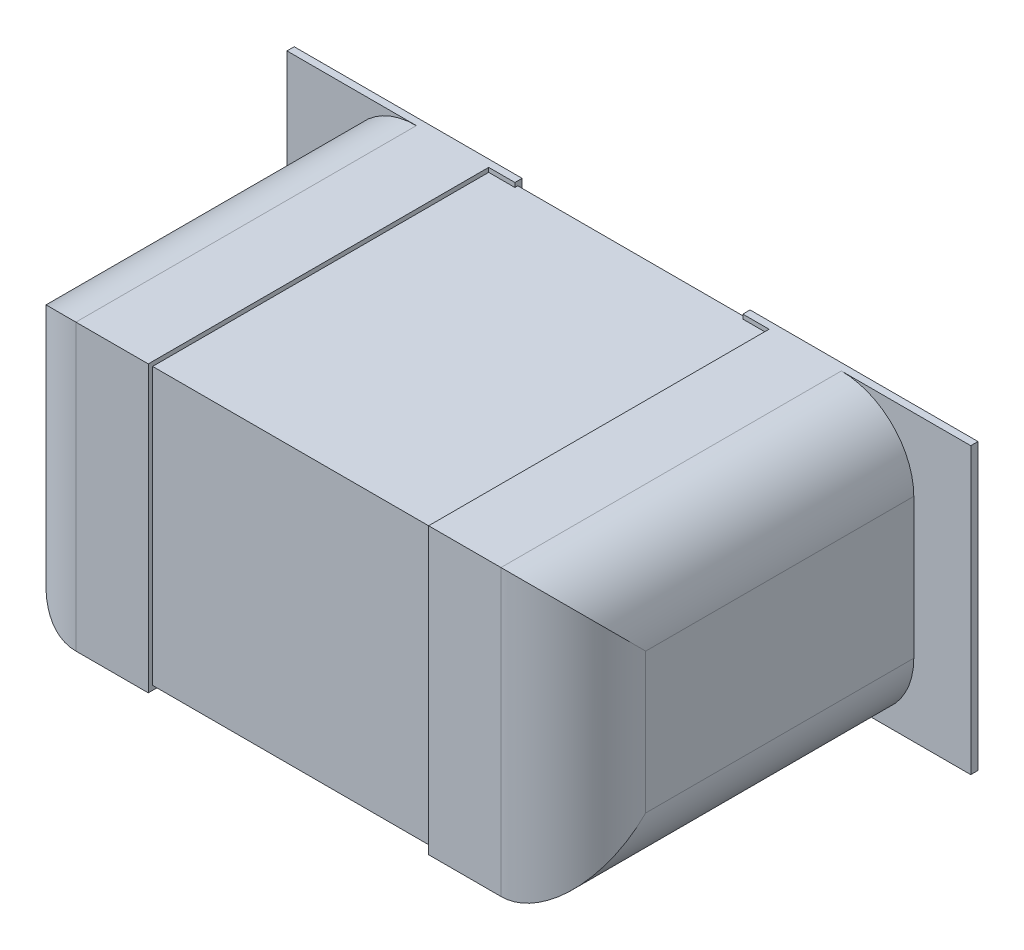
ISO-10303-21;
HEADER;
FILE_DESCRIPTION(('STEP AP214'),'2;1');
FILE_NAME('part.step','',(''),(''),'','','');
FILE_SCHEMA(('AUTOMOTIVE_DESIGN { 1 0 10303 214 1 1 1 1 }'));
ENDSEC;
DATA;
#1=APPLICATION_CONTEXT('core data for automotive mechanical design processes');
#2=APPLICATION_PROTOCOL_DEFINITION('international standard','automotive_design',2000,#1);
#3=PRODUCT_CONTEXT('',#1,'mechanical');
#4=PRODUCT('Part','Part','',(#3));
#5=PRODUCT_RELATED_PRODUCT_CATEGORY('part','',(#4));
#6=PRODUCT_DEFINITION_FORMATION('','',#4);
#7=PRODUCT_DEFINITION_CONTEXT('part definition',#1,'design');
#8=PRODUCT_DEFINITION('design','',#6,#7);
#9=PRODUCT_DEFINITION_SHAPE('','',#8);
#10=(LENGTH_UNIT() NAMED_UNIT(*) SI_UNIT(.MILLI.,.METRE.));
#11=(NAMED_UNIT(*) PLANE_ANGLE_UNIT() SI_UNIT($,.RADIAN.));
#12=(NAMED_UNIT(*) SI_UNIT($,.STERADIAN.) SOLID_ANGLE_UNIT());
#13=UNCERTAINTY_MEASURE_WITH_UNIT(LENGTH_MEASURE(1.E-05),#10,'distance_accuracy_value','');
#14=(GEOMETRIC_REPRESENTATION_CONTEXT(3) GLOBAL_UNCERTAINTY_ASSIGNED_CONTEXT((#13)) GLOBAL_UNIT_ASSIGNED_CONTEXT((#10,
#11,#12)) REPRESENTATION_CONTEXT('',''));
#15=CARTESIAN_POINT('',(0.,0.,0.));
#16=DIRECTION('',(0.,0.,1.));
#17=DIRECTION('',(1.,0.,0.));
#18=AXIS2_PLACEMENT_3D('',#15,#16,#17);
#19=CARTESIAN_POINT('',(0.500000000000032,-0.249999999999991,0.0762));
#20=DIRECTION('',(1.,0.,0.));
#21=DIRECTION('',(0.,0.,-1.));
#22=AXIS2_PLACEMENT_3D('',#19,#20,#21);
#23=PLANE('',#22);
#24=DIRECTION('',(0.,0.,-1.));
#25=VECTOR('',#24,1.);
#26=CARTESIAN_POINT('',(0.500000000000032,-0.122999999999991,0.68855504704387));
#27=LINE('',#26,#25);
#28=CARTESIAN_POINT('',(0.500000000000032,-0.122999999999991,0.0889));
#29=VERTEX_POINT('',#28);
#30=CARTESIAN_POINT('',(0.500000000000032,-0.122999999999991,0.559308));
#31=VERTEX_POINT('',#30);
#32=EDGE_CURVE('E325',#29,#31,#27,.F.);
#33=ORIENTED_EDGE('',*,*,#32,.F.);
#34=DIRECTION('',(0.,1.,0.));
#35=VECTOR('',#34,1.);
#36=CARTESIAN_POINT('',(0.500000000000032,0.,0.0889));
#37=LINE('',#36,#35);
#38=CARTESIAN_POINT('',(0.500000000000032,0.122999999999991,0.0889));
#39=VERTEX_POINT('',#38);
#40=EDGE_CURVE('E238',#39,#29,#37,.F.);
#41=ORIENTED_EDGE('',*,*,#40,.F.);
#42=DIRECTION('',(0.,0.,-1.));
#43=VECTOR('',#42,1.);
#44=CARTESIAN_POINT('',(0.500000000000032,0.122999999999991,0.68855504704387));
#45=LINE('',#44,#43);
#46=CARTESIAN_POINT('',(0.500000000000032,0.122999999999991,0.559308));
#47=VERTEX_POINT('',#46);
#48=EDGE_CURVE('E227',#47,#39,#45,.T.);
#49=ORIENTED_EDGE('',*,*,#48,.F.);
#50=DIRECTION('',(0.,1.,0.));
#51=VECTOR('',#50,1.);
#52=CARTESIAN_POINT('',(0.500000000000032,-0.252165539892753,0.559308));
#53=LINE('',#52,#51);
#54=EDGE_CURVE('E224',#31,#47,#53,.T.);
#55=ORIENTED_EDGE('',*,*,#54,.F.);
#56=EDGE_LOOP('',(#33,#41,#49,#55));
#57=FACE_BOUND('',#56,.T.);
#58=ADVANCED_FACE('F17',(#57),#23,.T.);
#59=CARTESIAN_POINT('',(-0.500000000000032,0.249999999999991,0.0762));
#60=DIRECTION('',(-1.,0.,0.));
#61=DIRECTION('',(0.,0.,1.));
#62=AXIS2_PLACEMENT_3D('',#59,#60,#61);
#63=PLANE('',#62);
#64=DIRECTION('',(0.,0.,-1.));
#65=VECTOR('',#64,1.);
#66=CARTESIAN_POINT('',(-0.500000000000032,0.122999999999991,0.68855504704387));
#67=LINE('',#66,#65);
#68=CARTESIAN_POINT('',(-0.500000000000032,0.122999999999991,0.0889));
#69=VERTEX_POINT('',#68);
#70=CARTESIAN_POINT('',(-0.500000000000032,0.122999999999991,0.559308));
#71=VERTEX_POINT('',#70);
#72=EDGE_CURVE('E309',#69,#71,#67,.F.);
#73=ORIENTED_EDGE('',*,*,#72,.F.);
#74=DIRECTION('',(0.,1.,0.));
#75=VECTOR('',#74,1.);
#76=CARTESIAN_POINT('',(-0.500000000000032,0.,0.0889));
#77=LINE('',#76,#75);
#78=CARTESIAN_POINT('',(-0.500000000000032,-0.122999999999991,0.0889));
#79=VERTEX_POINT('',#78);
#80=EDGE_CURVE('E313',#79,#69,#77,.T.);
#81=ORIENTED_EDGE('',*,*,#80,.F.);
#82=DIRECTION('',(0.,0.,-1.));
#83=VECTOR('',#82,1.);
#84=CARTESIAN_POINT('',(-0.500000000000032,-0.122999999999991,0.68855504704387));
#85=LINE('',#84,#83);
#86=CARTESIAN_POINT('',(-0.500000000000032,-0.122999999999991,0.559308));
#87=VERTEX_POINT('',#86);
#88=EDGE_CURVE('E316',#87,#79,#85,.T.);
#89=ORIENTED_EDGE('',*,*,#88,.F.);
#90=DIRECTION('',(0.,-1.,0.));
#91=VECTOR('',#90,1.);
#92=CARTESIAN_POINT('',(-0.500000000000032,0.25220810282373,0.559308));
#93=LINE('',#92,#91);
#94=EDGE_CURVE('E243',#71,#87,#93,.T.);
#95=ORIENTED_EDGE('',*,*,#94,.F.);
#96=EDGE_LOOP('',(#73,#81,#89,#95));
#97=FACE_BOUND('',#96,.T.);
#98=ADVANCED_FACE('F356',(#97),#63,.T.);
#99=CARTESIAN_POINT('',(-0.373000000000032,0.25220810282373,0.559308));
#100=DIRECTION('',(0.,-1.,0.));
#101=DIRECTION('',(0.,0.,-1.));
#102=AXIS2_PLACEMENT_3D('',#99,#100,#101);
#103=CYLINDRICAL_SURFACE('',#102,0.127);
#104=CARTESIAN_POINT('',(-0.373000000000032,-0.122999999999991,0.559308));
#105=DIRECTION('',(0.,-0.707106781186547,-0.707106781186547));
#106=DIRECTION('',(0.,0.707106781186547,-0.707106781186547));
#107=AXIS2_PLACEMENT_3D('',#104,#105,#106);
#108=ELLIPSE('',#107,0.179605122421383,0.127);
#109=CARTESIAN_POINT('',(-0.373000000000032,-0.249999999999991,0.686308));
#110=VERTEX_POINT('',#109);
#111=EDGE_CURVE('E317',#110,#87,#108,.T.);
#112=ORIENTED_EDGE('',*,*,#111,.F.);
#113=DIRECTION('',(0.,1.,0.));
#114=VECTOR('',#113,1.);
#115=CARTESIAN_POINT('',(-0.373000000000032,0.,0.686308));
#116=LINE('',#115,#114);
#117=CARTESIAN_POINT('',(-0.373000000000032,0.249999999999991,0.686308));
#118=VERTEX_POINT('',#117);
#119=EDGE_CURVE('E208',#118,#110,#116,.F.);
#120=ORIENTED_EDGE('',*,*,#119,.F.);
#121=CARTESIAN_POINT('',(-0.373000000000032,0.122999999999991,0.559308));
#122=DIRECTION('',(0.,0.707106781186547,-0.707106781186547));
#123=DIRECTION('',(0.,-0.707106781186547,-0.707106781186547));
#124=AXIS2_PLACEMENT_3D('',#121,#122,#123);
#125=ELLIPSE('',#124,0.179605122421383,0.127);
#126=EDGE_CURVE('E307',#71,#118,#125,.T.);
#127=ORIENTED_EDGE('',*,*,#126,.F.);
#128=ORIENTED_EDGE('',*,*,#94,.T.);
#129=EDGE_LOOP('',(#112,#120,#127,#128));
#130=FACE_BOUND('',#129,.T.);
#131=ADVANCED_FACE('F361',(#130),#103,.T.);
#132=CARTESIAN_POINT('',(0.373000000000032,-0.252165539892753,0.559308));
#133=DIRECTION('',(0.,1.,0.));
#134=DIRECTION('',(0.,0.,1.));
#135=AXIS2_PLACEMENT_3D('',#132,#133,#134);
#136=CYLINDRICAL_SURFACE('',#135,0.127);
#137=CARTESIAN_POINT('',(0.373000000000032,-0.122999999999991,0.559308));
#138=DIRECTION('',(0.,-0.707106781186547,-0.707106781186547));
#139=DIRECTION('',(0.,0.707106781186547,-0.707106781186547));
#140=AXIS2_PLACEMENT_3D('',#137,#138,#139);
#141=ELLIPSE('',#140,0.179605122421383,0.127);
#142=CARTESIAN_POINT('',(0.373000000000032,-0.249999999999991,0.686308));
#143=VERTEX_POINT('',#142);
#144=EDGE_CURVE('E323',#31,#143,#141,.T.);
#145=ORIENTED_EDGE('',*,*,#144,.F.);
#146=ORIENTED_EDGE('',*,*,#54,.T.);
#147=CARTESIAN_POINT('',(0.373000000000032,0.122999999999991,0.559308));
#148=DIRECTION('',(0.,0.707106781186547,-0.707106781186547));
#149=DIRECTION('',(0.,-0.707106781186547,-0.707106781186547));
#150=AXIS2_PLACEMENT_3D('',#147,#148,#149);
#151=ELLIPSE('',#150,0.179605122421383,0.127);
#152=CARTESIAN_POINT('',(0.373000000000032,0.249999999999991,0.686308));
#153=VERTEX_POINT('',#152);
#154=EDGE_CURVE('E20',#153,#47,#151,.T.);
#155=ORIENTED_EDGE('',*,*,#154,.F.);
#156=DIRECTION('',(0.,1.,0.));
#157=VECTOR('',#156,1.);
#158=CARTESIAN_POINT('',(0.373000000000032,0.,0.686308));
#159=LINE('',#158,#157);
#160=EDGE_CURVE('E198',#143,#153,#159,.T.);
#161=ORIENTED_EDGE('',*,*,#160,.F.);
#162=EDGE_LOOP('',(#145,#146,#155,#161));
#163=FACE_BOUND('',#162,.T.);
#164=ADVANCED_FACE('F222',(#163),#136,.T.);
#165=CARTESIAN_POINT('',(0.373000000000032,0.122999999999991,0.68855504704387));
#166=DIRECTION('',(0.,0.,-1.));
#167=DIRECTION('',(-1.,0.,0.));
#168=AXIS2_PLACEMENT_3D('',#165,#166,#167);
#169=CYLINDRICAL_SURFACE('',#168,0.127);
#170=ORIENTED_EDGE('',*,*,#48,.T.);
#171=CARTESIAN_POINT('',(0.373000000000032,0.122999999999991,0.0888999999999999));
#172=DIRECTION('',(0.,0.,-1.));
#173=DIRECTION('',(-1.,0.,0.));
#174=AXIS2_PLACEMENT_3D('',#171,#172,#173);
#175=CIRCLE('',#174,0.127);
#176=CARTESIAN_POINT('',(0.372860566844038,0.249999999999991,0.0889000162716309));
#177=VERTEX_POINT('',#176);
#178=EDGE_CURVE('E230',#177,#39,#175,.T.);
#179=ORIENTED_EDGE('',*,*,#178,.F.);
#180=DIRECTION('',(-0.000233396867792647,0.,-0.999999972762951));
#181=VECTOR('',#180,1.);
#182=CARTESIAN_POINT('',(0.373000000000032,0.249999999999991,0.686308));
#183=LINE('',#182,#181);
#184=EDGE_CURVE('E215',#153,#177,#183,.T.);
#185=ORIENTED_EDGE('',*,*,#184,.F.);
#186=ORIENTED_EDGE('',*,*,#154,.T.);
#187=EDGE_LOOP('',(#170,#179,#185,#186));
#188=FACE_BOUND('',#187,.T.);
#189=ADVANCED_FACE('F228',(#188),#169,.T.);
#190=CARTESIAN_POINT('',(0.5999988,-0.2500122,0.0762));
#191=DIRECTION('',(1.,0.,0.));
#192=DIRECTION('',(0.,0.,-1.));
#193=AXIS2_PLACEMENT_3D('',#190,#191,#192);
#194=PLANE('',#193);
#195=DIRECTION('',(0.,0.,-1.));
#196=VECTOR('',#195,1.);
#197=CARTESIAN_POINT('',(0.5999988,-0.249999999999991,0.0762));
#198=LINE('',#197,#196);
#199=CARTESIAN_POINT('',(0.5999988,-0.249999999999991,0.0762));
#200=VERTEX_POINT('',#199);
#201=CARTESIAN_POINT('',(0.5999988,-0.249999999999991,0.0889));
#202=VERTEX_POINT('',#201);
#203=EDGE_CURVE('E295',#200,#202,#198,.F.);
#204=ORIENTED_EDGE('',*,*,#203,.F.);
#205=DIRECTION('',(0.,1.,0.));
#206=VECTOR('',#205,1.);
#207=CARTESIAN_POINT('',(0.5999988,0.,0.0762));
#208=LINE('',#207,#206);
#209=CARTESIAN_POINT('',(0.5999988,0.249999999999991,0.0762));
#210=VERTEX_POINT('',#209);
#211=EDGE_CURVE('E298',#200,#210,#208,.T.);
#212=ORIENTED_EDGE('',*,*,#211,.T.);
#213=DIRECTION('',(0.,0.,1.));
#214=VECTOR('',#213,1.);
#215=CARTESIAN_POINT('',(0.5999988,0.249999999999991,0.0762));
#216=LINE('',#215,#214);
#217=CARTESIAN_POINT('',(0.5999988,0.249999999999991,0.0889));
#218=VERTEX_POINT('',#217);
#219=EDGE_CURVE('E234',#218,#210,#216,.F.);
#220=ORIENTED_EDGE('',*,*,#219,.F.);
#221=DIRECTION('',(0.,1.,0.));
#222=VECTOR('',#221,1.);
#223=CARTESIAN_POINT('',(0.5999988,0.,0.0889));
#224=LINE('',#223,#222);
#225=EDGE_CURVE('E241',#202,#218,#224,.T.);
#226=ORIENTED_EDGE('',*,*,#225,.F.);
#227=EDGE_LOOP('',(#204,#212,#220,#226));
#228=FACE_BOUND('',#227,.T.);
#229=ADVANCED_FACE('F336',(#228),#194,.T.);
#230=CARTESIAN_POINT('',(0.,0.,0.0889));
#231=DIRECTION('',(0.,0.,1.));
#232=DIRECTION('',(1.,0.,0.));
#233=AXIS2_PLACEMENT_3D('',#230,#231,#232);
#234=PLANE('',#233);
#235=ORIENTED_EDGE('',*,*,#178,.T.);
#236=ORIENTED_EDGE('',*,*,#40,.T.);
#237=CARTESIAN_POINT('',(0.373000000000032,-0.122999999999991,0.0888999999999999));
#238=DIRECTION('',(0.,0.,-1.));
#239=DIRECTION('',(-1.,0.,0.));
#240=AXIS2_PLACEMENT_3D('',#237,#238,#239);
#241=CIRCLE('',#240,0.127);
#242=CARTESIAN_POINT('',(0.372860566844038,-0.249999999999991,0.0889000162716309));
#243=VERTEX_POINT('',#242);
#244=EDGE_CURVE('E320',#243,#29,#241,.F.);
#245=ORIENTED_EDGE('',*,*,#244,.F.);
#246=DIRECTION('',(1.,0.,0.));
#247=VECTOR('',#246,1.);
#248=CARTESIAN_POINT('',(-0.500000000000032,-0.249999999999991,0.0889));
#249=LINE('',#248,#247);
#250=EDGE_CURVE('E297',#202,#243,#249,.F.);
#251=ORIENTED_EDGE('',*,*,#250,.F.);
#252=ORIENTED_EDGE('',*,*,#225,.T.);
#253=DIRECTION('',(1.,0.,0.));
#254=VECTOR('',#253,1.);
#255=CARTESIAN_POINT('',(0.500000000000032,0.249999999999991,0.0889));
#256=LINE('',#255,#254);
#257=EDGE_CURVE('E232',#177,#218,#256,.T.);
#258=ORIENTED_EDGE('',*,*,#257,.F.);
#259=EDGE_LOOP('',(#235,#236,#245,#251,#252,#258));
#260=FACE_BOUND('',#259,.T.);
#261=ADVANCED_FACE('F329',(#260),#234,.T.);
#262=CARTESIAN_POINT('',(0.373000000000032,-0.122999999999991,0.68855504704387));
#263=DIRECTION('',(0.,0.,-1.));
#264=DIRECTION('',(-1.,0.,0.));
#265=AXIS2_PLACEMENT_3D('',#262,#263,#264);
#266=CYLINDRICAL_SURFACE('',#265,0.127);
#267=DIRECTION('',(0.000233396867792647,0.,0.999999972762951));
#268=VECTOR('',#267,1.);
#269=CARTESIAN_POINT('',(0.37286056684024,-0.249999999999991,0.0889));
#270=LINE('',#269,#268);
#271=EDGE_CURVE('E343',#243,#143,#270,.T.);
#272=ORIENTED_EDGE('',*,*,#271,.F.);
#273=ORIENTED_EDGE('',*,*,#244,.T.);
#274=ORIENTED_EDGE('',*,*,#32,.T.);
#275=ORIENTED_EDGE('',*,*,#144,.T.);
#276=EDGE_LOOP('',(#272,#273,#274,#275));
#277=FACE_BOUND('',#276,.T.);
#278=ADVANCED_FACE('F353',(#277),#266,.T.);
#279=CARTESIAN_POINT('',(-0.373000000000032,-0.122999999999991,0.68855504704387));
#280=DIRECTION('',(0.,0.,-1.));
#281=DIRECTION('',(-1.,0.,0.));
#282=AXIS2_PLACEMENT_3D('',#279,#280,#281);
#283=CYLINDRICAL_SURFACE('',#282,0.127);
#284=ORIENTED_EDGE('',*,*,#88,.T.);
#285=CARTESIAN_POINT('',(-0.373000000000032,-0.122999999999991,0.0888999999999999));
#286=DIRECTION('',(0.,0.,-1.));
#287=DIRECTION('',(-1.,0.,0.));
#288=AXIS2_PLACEMENT_3D('',#285,#286,#287);
#289=CIRCLE('',#288,0.127);
#290=CARTESIAN_POINT('',(-0.372860566844038,-0.249999999999991,0.0889000162716309));
#291=VERTEX_POINT('',#290);
#292=EDGE_CURVE('E310',#291,#79,#289,.T.);
#293=ORIENTED_EDGE('',*,*,#292,.F.);
#294=DIRECTION('',(0.000233396867792647,0.,-0.999999972762951));
#295=VECTOR('',#294,1.);
#296=CARTESIAN_POINT('',(-0.373000000000032,-0.249999999999991,0.686308));
#297=LINE('',#296,#295);
#298=EDGE_CURVE('E290',#110,#291,#297,.T.);
#299=ORIENTED_EDGE('',*,*,#298,.F.);
#300=ORIENTED_EDGE('',*,*,#111,.T.);
#301=EDGE_LOOP('',(#284,#293,#299,#300));
#302=FACE_BOUND('',#301,.T.);
#303=ADVANCED_FACE('F450',(#302),#283,.T.);
#304=CARTESIAN_POINT('',(-0.5999988,0.2500122,0.0762));
#305=DIRECTION('',(-1.,0.,0.));
#306=DIRECTION('',(0.,0.,1.));
#307=AXIS2_PLACEMENT_3D('',#304,#305,#306);
#308=PLANE('',#307);
#309=DIRECTION('',(0.,0.,1.));
#310=VECTOR('',#309,1.);
#311=CARTESIAN_POINT('',(-0.5999988,0.249999999999991,0.0762));
#312=LINE('',#311,#310);
#313=CARTESIAN_POINT('',(-0.5999988,0.249999999999991,0.0762));
#314=VERTEX_POINT('',#313);
#315=CARTESIAN_POINT('',(-0.5999988,0.249999999999991,0.0889));
#316=VERTEX_POINT('',#315);
#317=EDGE_CURVE('E278',#314,#316,#312,.T.);
#318=ORIENTED_EDGE('',*,*,#317,.F.);
#319=DIRECTION('',(0.,1.,0.));
#320=VECTOR('',#319,1.);
#321=CARTESIAN_POINT('',(-0.5999988,0.,0.0762));
#322=LINE('',#321,#320);
#323=CARTESIAN_POINT('',(-0.5999988,-0.249999999999991,0.0762));
#324=VERTEX_POINT('',#323);
#325=EDGE_CURVE('E281',#314,#324,#322,.F.);
#326=ORIENTED_EDGE('',*,*,#325,.T.);
#327=DIRECTION('',(0.,0.,-1.));
#328=VECTOR('',#327,1.);
#329=CARTESIAN_POINT('',(-0.5999988,-0.249999999999991,0.0762));
#330=LINE('',#329,#328);
#331=CARTESIAN_POINT('',(-0.5999988,-0.249999999999991,0.0889));
#332=VERTEX_POINT('',#331);
#333=EDGE_CURVE('E285',#332,#324,#330,.T.);
#334=ORIENTED_EDGE('',*,*,#333,.F.);
#335=DIRECTION('',(0.,1.,0.));
#336=VECTOR('',#335,1.);
#337=CARTESIAN_POINT('',(-0.5999988,0.,0.0889));
#338=LINE('',#337,#336);
#339=EDGE_CURVE('E314',#316,#332,#338,.F.);
#340=ORIENTED_EDGE('',*,*,#339,.F.);
#341=EDGE_LOOP('',(#318,#326,#334,#340));
#342=FACE_BOUND('',#341,.T.);
#343=ADVANCED_FACE('F446',(#342),#308,.T.);
#344=CARTESIAN_POINT('',(0.,0.,0.0889));
#345=DIRECTION('',(0.,0.,1.));
#346=DIRECTION('',(1.,0.,0.));
#347=AXIS2_PLACEMENT_3D('',#344,#345,#346);
#348=PLANE('',#347);
#349=ORIENTED_EDGE('',*,*,#292,.T.);
#350=ORIENTED_EDGE('',*,*,#80,.T.);
#351=CARTESIAN_POINT('',(-0.373000000000032,0.122999999999991,0.0888999999999999));
#352=DIRECTION('',(0.,0.,-1.));
#353=DIRECTION('',(-1.,0.,0.));
#354=AXIS2_PLACEMENT_3D('',#351,#352,#353);
#355=CIRCLE('',#354,0.127);
#356=CARTESIAN_POINT('',(-0.372860566844038,0.249999999999991,0.0889000162716309));
#357=VERTEX_POINT('',#356);
#358=EDGE_CURVE('E304',#357,#69,#355,.F.);
#359=ORIENTED_EDGE('',*,*,#358,.F.);
#360=DIRECTION('',(1.,0.,0.));
#361=VECTOR('',#360,1.);
#362=CARTESIAN_POINT('',(0.500000000000032,0.249999999999991,0.0889));
#363=LINE('',#362,#361);
#364=EDGE_CURVE('E280',#316,#357,#363,.T.);
#365=ORIENTED_EDGE('',*,*,#364,.F.);
#366=ORIENTED_EDGE('',*,*,#339,.T.);
#367=DIRECTION('',(1.,0.,0.));
#368=VECTOR('',#367,1.);
#369=CARTESIAN_POINT('',(-0.500000000000032,-0.249999999999991,0.0889));
#370=LINE('',#369,#368);
#371=EDGE_CURVE('E287',#291,#332,#370,.F.);
#372=ORIENTED_EDGE('',*,*,#371,.F.);
#373=EDGE_LOOP('',(#349,#350,#359,#365,#366,#372));
#374=FACE_BOUND('',#373,.T.);
#375=ADVANCED_FACE('F442',(#374),#348,.T.);
#376=CARTESIAN_POINT('',(-0.373000000000032,0.122999999999991,0.68855504704387));
#377=DIRECTION('',(0.,0.,-1.));
#378=DIRECTION('',(-1.,0.,0.));
#379=AXIS2_PLACEMENT_3D('',#376,#377,#378);
#380=CYLINDRICAL_SURFACE('',#379,0.127);
#381=DIRECTION('',(-0.000233396867792647,0.,0.999999972762951));
#382=VECTOR('',#381,1.);
#383=CARTESIAN_POINT('',(-0.37286056684024,0.249999999999991,0.0889));
#384=LINE('',#383,#382);
#385=EDGE_CURVE('E483',#357,#118,#384,.T.);
#386=ORIENTED_EDGE('',*,*,#385,.F.);
#387=ORIENTED_EDGE('',*,*,#358,.T.);
#388=ORIENTED_EDGE('',*,*,#72,.T.);
#389=ORIENTED_EDGE('',*,*,#126,.T.);
#390=EDGE_LOOP('',(#386,#387,#388,#389));
#391=FACE_BOUND('',#390,.T.);
#392=ADVANCED_FACE('F438',(#391),#380,.T.);
#393=CARTESIAN_POINT('',(0.,0.,0.686308));
#394=DIRECTION('',(0.,0.,1.));
#395=DIRECTION('',(1.,0.,0.));
#396=AXIS2_PLACEMENT_3D('',#393,#394,#395);
#397=PLANE('',#396);
#398=DIRECTION('',(1.,0.,0.));
#399=VECTOR('',#398,1.);
#400=CARTESIAN_POINT('',(0.500000000000032,0.249999999999991,0.686308));
#401=LINE('',#400,#399);
#402=CARTESIAN_POINT('',(-0.246000000000007,0.249999999999991,0.686308));
#403=VERTEX_POINT('',#402);
#404=EDGE_CURVE('E277',#118,#403,#401,.T.);
#405=ORIENTED_EDGE('',*,*,#404,.F.);
#406=ORIENTED_EDGE('',*,*,#119,.T.);
#407=DIRECTION('',(1.,0.,0.));
#408=VECTOR('',#407,1.);
#409=CARTESIAN_POINT('',(-0.500000000000032,-0.249999999999991,0.686308));
#410=LINE('',#409,#408);
#411=CARTESIAN_POINT('',(-0.246000000000007,-0.250002711111104,0.686308));
#412=VERTEX_POINT('',#411);
#413=EDGE_CURVE('E294',#412,#110,#410,.F.);
#414=ORIENTED_EDGE('',*,*,#413,.F.);
#415=DIRECTION('',(0.,1.,0.));
#416=VECTOR('',#415,1.);
#417=CARTESIAN_POINT('',(-0.246000000000007,-0.249999999999991,0.686308));
#418=LINE('',#417,#416);
#419=EDGE_CURVE('E514',#412,#403,#418,.T.);
#420=ORIENTED_EDGE('',*,*,#419,.T.);
#421=EDGE_LOOP('',(#405,#406,#414,#420));
#422=FACE_BOUND('',#421,.T.);
#423=ADVANCED_FACE('F435',(#422),#397,.T.);
#424=CARTESIAN_POINT('',(0.,0.,0.686308));
#425=DIRECTION('',(0.,0.,1.));
#426=DIRECTION('',(1.,0.,0.));
#427=AXIS2_PLACEMENT_3D('',#424,#425,#426);
#428=PLANE('',#427);
#429=DIRECTION('',(1.,0.,0.));
#430=VECTOR('',#429,1.);
#431=CARTESIAN_POINT('',(-0.500000000000032,-0.249999999999991,0.686308));
#432=LINE('',#431,#430);
#433=CARTESIAN_POINT('',(0.246000000000007,-0.249999999999991,0.686308));
#434=VERTEX_POINT('',#433);
#435=EDGE_CURVE('E204',#143,#434,#432,.F.);
#436=ORIENTED_EDGE('',*,*,#435,.F.);
#437=ORIENTED_EDGE('',*,*,#160,.T.);
#438=DIRECTION('',(1.,0.,0.));
#439=VECTOR('',#438,1.);
#440=CARTESIAN_POINT('',(0.500000000000032,0.249999999999991,0.686308));
#441=LINE('',#440,#439);
#442=CARTESIAN_POINT('',(0.246000000000007,0.250002711111104,0.686308));
#443=VERTEX_POINT('',#442);
#444=EDGE_CURVE('E202',#443,#153,#441,.T.);
#445=ORIENTED_EDGE('',*,*,#444,.F.);
#446=DIRECTION('',(0.,1.,0.));
#447=VECTOR('',#446,1.);
#448=CARTESIAN_POINT('',(0.246000000000007,-0.249999999999991,0.686308));
#449=LINE('',#448,#447);
#450=EDGE_CURVE('E569',#443,#434,#449,.F.);
#451=ORIENTED_EDGE('',*,*,#450,.T.);
#452=EDGE_LOOP('',(#436,#437,#445,#451));
#453=FACE_BOUND('',#452,.T.);
#454=ADVANCED_FACE('F200',(#453),#428,.T.);
#455=CARTESIAN_POINT('',(0.,0.,0.0889));
#456=DIRECTION('',(0.,0.,1.));
#457=DIRECTION('',(1.,0.,0.));
#458=AXIS2_PLACEMENT_3D('',#455,#456,#457);
#459=PLANE('',#458);
#460=DIRECTION('',(1.,0.,0.));
#461=VECTOR('',#460,1.);
#462=CARTESIAN_POINT('',(-0.246000000000007,0.242379999999991,0.0889));
#463=LINE('',#462,#461);
#464=CARTESIAN_POINT('',(0.1999996,0.242379999999991,0.0889));
#465=VERTEX_POINT('',#464);
#466=CARTESIAN_POINT('',(0.246000000000007,0.242379999999991,0.0889));
#467=VERTEX_POINT('',#466);
#468=EDGE_CURVE('E530',#465,#467,#463,.T.);
#469=ORIENTED_EDGE('',*,*,#468,.T.);
#470=DIRECTION('',(0.,1.,0.));
#471=VECTOR('',#470,1.);
#472=CARTESIAN_POINT('',(0.246000000000007,-0.249999999999991,0.0889));
#473=LINE('',#472,#471);
#474=CARTESIAN_POINT('',(0.246000000000007,0.250002033333325,0.0889));
#475=VERTEX_POINT('',#474);
#476=EDGE_CURVE('E559',#467,#475,#473,.T.);
#477=ORIENTED_EDGE('',*,*,#476,.T.);
#478=DIRECTION('',(1.,0.,0.));
#479=VECTOR('',#478,1.);
#480=CARTESIAN_POINT('',(0.500000000000032,0.249999999999991,0.0889));
#481=LINE('',#480,#479);
#482=CARTESIAN_POINT('',(0.1999996,0.249999999999991,0.0889));
#483=VERTEX_POINT('',#482);
#484=EDGE_CURVE('E302',#483,#475,#481,.T.);
#485=ORIENTED_EDGE('',*,*,#484,.F.);
#486=DIRECTION('',(0.,1.,0.));
#487=VECTOR('',#486,1.);
#488=CARTESIAN_POINT('',(0.1999996,0.2500122,0.0889));
#489=LINE('',#488,#487);
#490=EDGE_CURVE('E258',#465,#483,#489,.T.);
#491=ORIENTED_EDGE('',*,*,#490,.F.);
#492=EDGE_LOOP('',(#469,#477,#485,#491));
#493=FACE_BOUND('',#492,.T.);
#494=ADVANCED_FACE('F429',(#493),#459,.T.);
#495=CARTESIAN_POINT('',(0.500000000000032,0.249999999999991,0.0762));
#496=DIRECTION('',(0.,1.,0.));
#497=DIRECTION('',(0.,0.,1.));
#498=AXIS2_PLACEMENT_3D('',#495,#496,#497);
#499=PLANE('',#498);
#500=ORIENTED_EDGE('',*,*,#484,.T.);
#501=DIRECTION('',(0.,0.,-1.));
#502=VECTOR('',#501,1.);
#503=CARTESIAN_POINT('',(0.246000000000007,0.25000406666666,0.08382));
#504=LINE('',#503,#502);
#505=EDGE_CURVE('E218',#475,#443,#504,.F.);
#506=ORIENTED_EDGE('',*,*,#505,.T.);
#507=ORIENTED_EDGE('',*,*,#444,.T.);
#508=ORIENTED_EDGE('',*,*,#184,.T.);
#509=ORIENTED_EDGE('',*,*,#257,.T.);
#510=ORIENTED_EDGE('',*,*,#219,.T.);
#511=DIRECTION('',(1.,0.,0.));
#512=VECTOR('',#511,1.);
#513=CARTESIAN_POINT('',(0.500000000000032,0.249999999999991,0.0762));
#514=LINE('',#513,#512);
#515=CARTESIAN_POINT('',(0.1999996,0.249999999999991,0.0762));
#516=VERTEX_POINT('',#515);
#517=EDGE_CURVE('E299',#210,#516,#514,.F.);
#518=ORIENTED_EDGE('',*,*,#517,.T.);
#519=DIRECTION('',(0.,0.,-1.));
#520=VECTOR('',#519,1.);
#521=CARTESIAN_POINT('',(0.1999996,0.249999999999991,0.0762));
#522=LINE('',#521,#520);
#523=EDGE_CURVE('E256',#483,#516,#522,.T.);
#524=ORIENTED_EDGE('',*,*,#523,.F.);
#525=EDGE_LOOP('',(#500,#506,#507,#508,#509,#510,#518,#524));
#526=FACE_BOUND('',#525,.T.);
#527=ADVANCED_FACE('F212',(#526),#499,.T.);
#528=CARTESIAN_POINT('',(0.,0.,0.0762));
#529=DIRECTION('',(0.,0.,1.));
#530=DIRECTION('',(1.,0.,0.));
#531=AXIS2_PLACEMENT_3D('',#528,#529,#530);
#532=PLANE('',#531);
#533=DIRECTION('',(1.,0.,0.));
#534=VECTOR('',#533,1.);
#535=CARTESIAN_POINT('',(-0.500000000000032,-0.249999999999991,0.0762));
#536=LINE('',#535,#534);
#537=CARTESIAN_POINT('',(0.1999996,-0.249999999999991,0.0762));
#538=VERTEX_POINT('',#537);
#539=EDGE_CURVE('E291',#538,#200,#536,.T.);
#540=ORIENTED_EDGE('',*,*,#539,.F.);
#541=DIRECTION('',(0.,1.,0.));
#542=VECTOR('',#541,1.);
#543=CARTESIAN_POINT('',(0.1999996,0.2500122,0.0762));
#544=LINE('',#543,#542);
#545=EDGE_CURVE('E255',#516,#538,#544,.F.);
#546=ORIENTED_EDGE('',*,*,#545,.F.);
#547=ORIENTED_EDGE('',*,*,#517,.F.);
#548=ORIENTED_EDGE('',*,*,#211,.F.);
#549=EDGE_LOOP('',(#540,#546,#547,#548));
#550=FACE_BOUND('',#549,.T.);
#551=ADVANCED_FACE('F424',(#550),#532,.F.);
#552=CARTESIAN_POINT('',(-0.500000000000032,-0.249999999999991,0.0762));
#553=DIRECTION('',(0.,-1.,0.));
#554=DIRECTION('',(0.,0.,-1.));
#555=AXIS2_PLACEMENT_3D('',#552,#553,#554);
#556=PLANE('',#555);
#557=DIRECTION('',(0.,0.,1.));
#558=VECTOR('',#557,1.);
#559=CARTESIAN_POINT('',(0.1999996,-0.249999999999991,0.0762));
#560=LINE('',#559,#558);
#561=CARTESIAN_POINT('',(0.1999996,-0.249999999999991,0.0889));
#562=VERTEX_POINT('',#561);
#563=EDGE_CURVE('E252',#538,#562,#560,.T.);
#564=ORIENTED_EDGE('',*,*,#563,.F.);
#565=ORIENTED_EDGE('',*,*,#539,.T.);
#566=ORIENTED_EDGE('',*,*,#203,.T.);
#567=ORIENTED_EDGE('',*,*,#250,.T.);
#568=ORIENTED_EDGE('',*,*,#271,.T.);
#569=ORIENTED_EDGE('',*,*,#435,.T.);
#570=DIRECTION('',(0.,0.,-1.));
#571=VECTOR('',#570,1.);
#572=CARTESIAN_POINT('',(0.246000000000007,-0.249999999999991,0.08382));
#573=LINE('',#572,#571);
#574=CARTESIAN_POINT('',(0.246000000000007,-0.249999999999991,0.0889));
#575=VERTEX_POINT('',#574);
#576=EDGE_CURVE('E265',#434,#575,#573,.T.);
#577=ORIENTED_EDGE('',*,*,#576,.T.);
#578=DIRECTION('',(1.,0.,0.));
#579=VECTOR('',#578,1.);
#580=CARTESIAN_POINT('',(0.,-0.249999999999991,0.0889));
#581=LINE('',#580,#579);
#582=EDGE_CURVE('E259',#562,#575,#581,.T.);
#583=ORIENTED_EDGE('',*,*,#582,.F.);
#584=EDGE_LOOP('',(#564,#565,#566,#567,#568,#569,#577,#583));
#585=FACE_BOUND('',#584,.T.);
#586=ADVANCED_FACE('F348',(#585),#556,.T.);
#587=CARTESIAN_POINT('',(-0.500000000000032,-0.249999999999991,0.0762));
#588=DIRECTION('',(0.,-1.,0.));
#589=DIRECTION('',(0.,0.,-1.));
#590=AXIS2_PLACEMENT_3D('',#587,#588,#589);
#591=PLANE('',#590);
#592=DIRECTION('',(1.,0.,0.));
#593=VECTOR('',#592,1.);
#594=CARTESIAN_POINT('',(0.,-0.25000406666666,0.0889));
#595=LINE('',#594,#593);
#596=CARTESIAN_POINT('',(-0.246000000000007,-0.250003388888882,0.0889));
#597=VERTEX_POINT('',#596);
#598=CARTESIAN_POINT('',(-0.1999996,-0.250002033333325,0.0889));
#599=VERTEX_POINT('',#598);
#600=EDGE_CURVE('E507',#597,#599,#595,.T.);
#601=ORIENTED_EDGE('',*,*,#600,.F.);
#602=DIRECTION('',(0.,0.,1.));
#603=VECTOR('',#602,1.);
#604=CARTESIAN_POINT('',(-0.246000000000007,-0.25000406666666,0.0762));
#605=LINE('',#604,#603);
#606=EDGE_CURVE('E506',#597,#412,#605,.T.);
#607=ORIENTED_EDGE('',*,*,#606,.T.);
#608=ORIENTED_EDGE('',*,*,#413,.T.);
#609=ORIENTED_EDGE('',*,*,#298,.T.);
#610=ORIENTED_EDGE('',*,*,#371,.T.);
#611=ORIENTED_EDGE('',*,*,#333,.T.);
#612=DIRECTION('',(1.,0.,0.));
#613=VECTOR('',#612,1.);
#614=CARTESIAN_POINT('',(-0.500000000000032,-0.249999999999991,0.0762));
#615=LINE('',#614,#613);
#616=CARTESIAN_POINT('',(-0.1999996,-0.249999999999991,0.0762));
#617=VERTEX_POINT('',#616);
#618=EDGE_CURVE('E282',#324,#617,#615,.T.);
#619=ORIENTED_EDGE('',*,*,#618,.T.);
#620=DIRECTION('',(0.,0.,-1.));
#621=VECTOR('',#620,1.);
#622=CARTESIAN_POINT('',(-0.1999996,-0.249999999999991,0.0762));
#623=LINE('',#622,#621);
#624=EDGE_CURVE('E249',#599,#617,#623,.T.);
#625=ORIENTED_EDGE('',*,*,#624,.F.);
#626=EDGE_LOOP('',(#601,#607,#608,#609,#610,#611,#619,#625));
#627=FACE_BOUND('',#626,.T.);
#628=ADVANCED_FACE('F417',(#627),#591,.T.);
#629=CARTESIAN_POINT('',(0.,0.,0.0762));
#630=DIRECTION('',(0.,0.,1.));
#631=DIRECTION('',(1.,0.,0.));
#632=AXIS2_PLACEMENT_3D('',#629,#630,#631);
#633=PLANE('',#632);
#634=DIRECTION('',(1.,0.,0.));
#635=VECTOR('',#634,1.);
#636=CARTESIAN_POINT('',(0.500000000000032,0.249999999999991,0.0762));
#637=LINE('',#636,#635);
#638=CARTESIAN_POINT('',(-0.1999996,0.249999999999991,0.0762));
#639=VERTEX_POINT('',#638);
#640=EDGE_CURVE('E274',#639,#314,#637,.F.);
#641=ORIENTED_EDGE('',*,*,#640,.F.);
#642=DIRECTION('',(0.,1.,0.));
#643=VECTOR('',#642,1.);
#644=CARTESIAN_POINT('',(-0.1999996,-0.2500122,0.0762));
#645=LINE('',#644,#643);
#646=EDGE_CURVE('E248',#617,#639,#645,.T.);
#647=ORIENTED_EDGE('',*,*,#646,.F.);
#648=ORIENTED_EDGE('',*,*,#618,.F.);
#649=ORIENTED_EDGE('',*,*,#325,.F.);
#650=EDGE_LOOP('',(#641,#647,#648,#649));
#651=FACE_BOUND('',#650,.T.);
#652=ADVANCED_FACE('F413',(#651),#633,.F.);
#653=CARTESIAN_POINT('',(0.500000000000032,0.249999999999991,0.0762));
#654=DIRECTION('',(0.,1.,0.));
#655=DIRECTION('',(0.,0.,1.));
#656=AXIS2_PLACEMENT_3D('',#653,#654,#655);
#657=PLANE('',#656);
#658=DIRECTION('',(0.,0.,1.));
#659=VECTOR('',#658,1.);
#660=CARTESIAN_POINT('',(-0.1999996,0.249999999999991,0.0762));
#661=LINE('',#660,#659);
#662=CARTESIAN_POINT('',(-0.1999996,0.249999999999991,0.0889));
#663=VERTEX_POINT('',#662);
#664=EDGE_CURVE('E245',#639,#663,#661,.T.);
#665=ORIENTED_EDGE('',*,*,#664,.F.);
#666=ORIENTED_EDGE('',*,*,#640,.T.);
#667=ORIENTED_EDGE('',*,*,#317,.T.);
#668=ORIENTED_EDGE('',*,*,#364,.T.);
#669=ORIENTED_EDGE('',*,*,#385,.T.);
#670=ORIENTED_EDGE('',*,*,#404,.T.);
#671=DIRECTION('',(0.,0.,1.));
#672=VECTOR('',#671,1.);
#673=CARTESIAN_POINT('',(-0.246000000000007,0.249999999999991,0.0762));
#674=LINE('',#673,#672);
#675=CARTESIAN_POINT('',(-0.246000000000007,0.249999999999991,0.0889));
#676=VERTEX_POINT('',#675);
#677=EDGE_CURVE('E270',#403,#676,#674,.F.);
#678=ORIENTED_EDGE('',*,*,#677,.T.);
#679=DIRECTION('',(-1.,0.,0.));
#680=VECTOR('',#679,1.);
#681=CARTESIAN_POINT('',(0.,0.249999999999991,0.0889));
#682=LINE('',#681,#680);
#683=EDGE_CURVE('E271',#663,#676,#682,.T.);
#684=ORIENTED_EDGE('',*,*,#683,.F.);
#685=EDGE_LOOP('',(#665,#666,#667,#668,#669,#670,#678,#684));
#686=FACE_BOUND('',#685,.T.);
#687=ADVANCED_FACE('F409',(#686),#657,.T.);
#688=CARTESIAN_POINT('',(0.,0.,0.0889));
#689=DIRECTION('',(0.,0.,1.));
#690=DIRECTION('',(1.,0.,0.));
#691=AXIS2_PLACEMENT_3D('',#688,#689,#690);
#692=PLANE('',#691);
#693=DIRECTION('',(0.,1.,0.));
#694=VECTOR('',#693,1.);
#695=CARTESIAN_POINT('',(-0.1999996,-0.2500122,0.0889));
#696=LINE('',#695,#694);
#697=CARTESIAN_POINT('',(-0.1999996,0.242379999999991,0.0889));
#698=VERTEX_POINT('',#697);
#699=EDGE_CURVE('E247',#663,#698,#696,.F.);
#700=ORIENTED_EDGE('',*,*,#699,.F.);
#701=ORIENTED_EDGE('',*,*,#683,.T.);
#702=DIRECTION('',(0.,1.,0.));
#703=VECTOR('',#702,1.);
#704=CARTESIAN_POINT('',(-0.246000000000007,0.,0.0889));
#705=LINE('',#704,#703);
#706=CARTESIAN_POINT('',(-0.246000000000007,0.242379999999991,0.0889));
#707=VERTEX_POINT('',#706);
#708=EDGE_CURVE('E266',#676,#707,#705,.F.);
#709=ORIENTED_EDGE('',*,*,#708,.T.);
#710=DIRECTION('',(1.,0.,0.));
#711=VECTOR('',#710,1.);
#712=CARTESIAN_POINT('',(-0.246000000000007,0.242379999999991,0.0889));
#713=LINE('',#712,#711);
#714=EDGE_CURVE('E273',#707,#698,#713,.T.);
#715=ORIENTED_EDGE('',*,*,#714,.T.);
#716=EDGE_LOOP('',(#700,#701,#709,#715));
#717=FACE_BOUND('',#716,.T.);
#718=ADVANCED_FACE('F405',(#717),#692,.T.);
#719=CARTESIAN_POINT('',(-0.246000000000007,0.242379999999991,0.0762));
#720=DIRECTION('',(0.,-1.,0.));
#721=DIRECTION('',(0.,0.,-1.));
#722=AXIS2_PLACEMENT_3D('',#719,#720,#721);
#723=PLANE('',#722);
#724=DIRECTION('',(-1.,0.,0.));
#725=VECTOR('',#724,1.);
#726=CARTESIAN_POINT('',(-0.246000000000007,0.242379999999991,0.678688));
#727=LINE('',#726,#725);
#728=CARTESIAN_POINT('',(-0.246000000000007,0.242379999999991,0.678688));
#729=VERTEX_POINT('',#728);
#730=CARTESIAN_POINT('',(0.246000000000007,0.242379999999991,0.678688));
#731=VERTEX_POINT('',#730);
#732=EDGE_CURVE('E537',#729,#731,#727,.F.);
#733=ORIENTED_EDGE('',*,*,#732,.T.);
#734=DIRECTION('',(0.,0.,-1.));
#735=VECTOR('',#734,1.);
#736=CARTESIAN_POINT('',(0.246000000000007,0.242379999999991,0.08382));
#737=LINE('',#736,#735);
#738=EDGE_CURVE('E554',#731,#467,#737,.T.);
#739=ORIENTED_EDGE('',*,*,#738,.T.);
#740=ORIENTED_EDGE('',*,*,#468,.F.);
#741=DIRECTION('',(0.,0.,1.));
#742=VECTOR('',#741,1.);
#743=CARTESIAN_POINT('',(0.1999996,0.242379999999991,0.0762));
#744=LINE('',#743,#742);
#745=CARTESIAN_POINT('',(0.1999996,0.242379999999991,0.08382));
#746=VERTEX_POINT('',#745);
#747=EDGE_CURVE('E262',#746,#465,#744,.T.);
#748=ORIENTED_EDGE('',*,*,#747,.F.);
#749=DIRECTION('',(1.,0.,0.));
#750=VECTOR('',#749,1.);
#751=CARTESIAN_POINT('',(-0.246000000000007,0.242379999999991,0.08382));
#752=LINE('',#751,#750);
#753=CARTESIAN_POINT('',(-0.1999996,0.242379999999991,0.08382));
#754=VERTEX_POINT('',#753);
#755=EDGE_CURVE('E592',#746,#754,#752,.F.);
#756=ORIENTED_EDGE('',*,*,#755,.T.);
#757=DIRECTION('',(0.,0.,-1.));
#758=VECTOR('',#757,1.);
#759=CARTESIAN_POINT('',(-0.1999996,0.242379999999991,0.0762));
#760=LINE('',#759,#758);
#761=EDGE_CURVE('E492',#698,#754,#760,.T.);
#762=ORIENTED_EDGE('',*,*,#761,.F.);
#763=ORIENTED_EDGE('',*,*,#714,.F.);
#764=DIRECTION('',(0.,0.,1.));
#765=VECTOR('',#764,1.);
#766=CARTESIAN_POINT('',(-0.246000000000007,0.242379999999991,0.0762));
#767=LINE('',#766,#765);
#768=EDGE_CURVE('E269',#707,#729,#767,.T.);
#769=ORIENTED_EDGE('',*,*,#768,.T.);
#770=EDGE_LOOP('',(#733,#739,#740,#748,#756,#762,#763,#769));
#771=FACE_BOUND('',#770,.T.);
#772=ADVANCED_FACE('F401',(#771),#723,.F.);
#773=CARTESIAN_POINT('',(0.,0.,0.0889));
#774=DIRECTION('',(0.,0.,1.));
#775=DIRECTION('',(1.,0.,0.));
#776=AXIS2_PLACEMENT_3D('',#773,#774,#775);
#777=PLANE('',#776);
#778=DIRECTION('',(1.,0.,0.));
#779=VECTOR('',#778,1.);
#780=CARTESIAN_POINT('',(-0.246000000000007,-0.242379999999991,0.0888999999999999));
#781=LINE('',#780,#779);
#782=CARTESIAN_POINT('',(-0.1999996,-0.242379999999991,0.0889));
#783=VERTEX_POINT('',#782);
#784=CARTESIAN_POINT('',(-0.246000000000007,-0.242379999999991,0.0889));
#785=VERTEX_POINT('',#784);
#786=EDGE_CURVE('E500',#783,#785,#781,.F.);
#787=ORIENTED_EDGE('',*,*,#786,.T.);
#788=DIRECTION('',(0.,1.,0.));
#789=VECTOR('',#788,1.);
#790=CARTESIAN_POINT('',(-0.246000000000007,-0.249999999999991,0.0889));
#791=LINE('',#790,#789);
#792=EDGE_CURVE('E503',#785,#597,#791,.F.);
#793=ORIENTED_EDGE('',*,*,#792,.T.);
#794=ORIENTED_EDGE('',*,*,#600,.T.);
#795=DIRECTION('',(0.,1.,0.));
#796=VECTOR('',#795,1.);
#797=CARTESIAN_POINT('',(-0.1999996,-0.2500122,0.0889));
#798=LINE('',#797,#796);
#799=EDGE_CURVE('E251',#783,#599,#798,.F.);
#800=ORIENTED_EDGE('',*,*,#799,.F.);
#801=EDGE_LOOP('',(#787,#793,#794,#800));
#802=FACE_BOUND('',#801,.T.);
#803=ADVANCED_FACE('F397',(#802),#777,.T.);
#804=CARTESIAN_POINT('',(-0.246000000000007,-0.249999999999991,0.0762));
#805=DIRECTION('',(-1.,0.,0.));
#806=DIRECTION('',(0.,0.,1.));
#807=AXIS2_PLACEMENT_3D('',#804,#805,#806);
#808=PLANE('',#807);
#809=DIRECTION('',(0.,1.,0.));
#810=VECTOR('',#809,1.);
#811=CARTESIAN_POINT('',(-0.246000000000007,0.249999999999991,0.678688));
#812=LINE('',#811,#810);
#813=CARTESIAN_POINT('',(-0.246000000000007,-0.242379999999991,0.678688));
#814=VERTEX_POINT('',#813);
#815=EDGE_CURVE('E533',#814,#729,#812,.T.);
#816=ORIENTED_EDGE('',*,*,#815,.T.);
#817=ORIENTED_EDGE('',*,*,#768,.F.);
#818=ORIENTED_EDGE('',*,*,#708,.F.);
#819=ORIENTED_EDGE('',*,*,#677,.F.);
#820=ORIENTED_EDGE('',*,*,#419,.F.);
#821=ORIENTED_EDGE('',*,*,#606,.F.);
#822=ORIENTED_EDGE('',*,*,#792,.F.);
#823=DIRECTION('',(0.,0.,1.));
#824=VECTOR('',#823,1.);
#825=CARTESIAN_POINT('',(-0.246000000000007,-0.242379999999991,0.686308));
#826=LINE('',#825,#824);
#827=EDGE_CURVE('E496',#785,#814,#826,.T.);
#828=ORIENTED_EDGE('',*,*,#827,.T.);
#829=EDGE_LOOP('',(#816,#817,#818,#819,#820,#821,#822,#828));
#830=FACE_BOUND('',#829,.T.);
#831=ADVANCED_FACE('F393',(#830),#808,.F.);
#832=CARTESIAN_POINT('',(-0.246000000000007,0.249999999999991,0.678688));
#833=DIRECTION('',(0.,0.,-1.));
#834=DIRECTION('',(-1.,0.,0.));
#835=AXIS2_PLACEMENT_3D('',#832,#833,#834);
#836=PLANE('',#835);
#837=DIRECTION('',(1.,0.,0.));
#838=VECTOR('',#837,1.);
#839=CARTESIAN_POINT('',(-0.246000000000007,-0.242379999999991,0.678688));
#840=LINE('',#839,#838);
#841=CARTESIAN_POINT('',(0.246000000000007,-0.242379999999991,0.678688));
#842=VERTEX_POINT('',#841);
#843=EDGE_CURVE('E499',#814,#842,#840,.T.);
#844=ORIENTED_EDGE('',*,*,#843,.T.);
#845=DIRECTION('',(0.,1.,0.));
#846=VECTOR('',#845,1.);
#847=CARTESIAN_POINT('',(0.246000000000007,-0.249999999999991,0.678688));
#848=LINE('',#847,#846);
#849=EDGE_CURVE('E536',#842,#731,#848,.T.);
#850=ORIENTED_EDGE('',*,*,#849,.T.);
#851=ORIENTED_EDGE('',*,*,#732,.F.);
#852=ORIENTED_EDGE('',*,*,#815,.F.);
#853=EDGE_LOOP('',(#844,#850,#851,#852));
#854=FACE_BOUND('',#853,.T.);
#855=ADVANCED_FACE('F389',(#854),#836,.F.);
#856=CARTESIAN_POINT('',(0.246000000000007,-0.249999999999991,0.08382));
#857=DIRECTION('',(1.,0.,0.));
#858=DIRECTION('',(0.,0.,-1.));
#859=AXIS2_PLACEMENT_3D('',#856,#857,#858);
#860=PLANE('',#859);
#861=ORIENTED_EDGE('',*,*,#450,.F.);
#862=ORIENTED_EDGE('',*,*,#505,.F.);
#863=ORIENTED_EDGE('',*,*,#476,.F.);
#864=ORIENTED_EDGE('',*,*,#738,.F.);
#865=ORIENTED_EDGE('',*,*,#849,.F.);
#866=DIRECTION('',(0.,0.,1.));
#867=VECTOR('',#866,1.);
#868=CARTESIAN_POINT('',(0.246000000000007,-0.242379999999991,0.686308));
#869=LINE('',#868,#867);
#870=CARTESIAN_POINT('',(0.246000000000007,-0.242379999999991,0.0889));
#871=VERTEX_POINT('',#870);
#872=EDGE_CURVE('E546',#842,#871,#869,.F.);
#873=ORIENTED_EDGE('',*,*,#872,.T.);
#874=DIRECTION('',(0.,1.,0.));
#875=VECTOR('',#874,1.);
#876=CARTESIAN_POINT('',(0.246000000000007,0.,0.0889));
#877=LINE('',#876,#875);
#878=EDGE_CURVE('E263',#575,#871,#877,.T.);
#879=ORIENTED_EDGE('',*,*,#878,.F.);
#880=ORIENTED_EDGE('',*,*,#576,.F.);
#881=EDGE_LOOP('',(#861,#862,#863,#864,#865,#873,#879,#880));
#882=FACE_BOUND('',#881,.T.);
#883=ADVANCED_FACE('F385',(#882),#860,.F.);
#884=CARTESIAN_POINT('',(0.,0.,0.0889));
#885=DIRECTION('',(0.,0.,1.));
#886=DIRECTION('',(1.,0.,0.));
#887=AXIS2_PLACEMENT_3D('',#884,#885,#886);
#888=PLANE('',#887);
#889=DIRECTION('',(0.,1.,0.));
#890=VECTOR('',#889,1.);
#891=CARTESIAN_POINT('',(0.1999996,0.2500122,0.0889));
#892=LINE('',#891,#890);
#893=CARTESIAN_POINT('',(0.1999996,-0.242379999999991,0.0889));
#894=VERTEX_POINT('',#893);
#895=EDGE_CURVE('E254',#562,#894,#892,.T.);
#896=ORIENTED_EDGE('',*,*,#895,.F.);
#897=ORIENTED_EDGE('',*,*,#582,.T.);
#898=ORIENTED_EDGE('',*,*,#878,.T.);
#899=DIRECTION('',(1.,0.,0.));
#900=VECTOR('',#899,1.);
#901=CARTESIAN_POINT('',(-0.246000000000007,-0.242379999999991,0.0888999999999999));
#902=LINE('',#901,#900);
#903=EDGE_CURVE('E583',#871,#894,#902,.F.);
#904=ORIENTED_EDGE('',*,*,#903,.T.);
#905=EDGE_LOOP('',(#896,#897,#898,#904));
#906=FACE_BOUND('',#905,.T.);
#907=ADVANCED_FACE('F381',(#906),#888,.T.);
#908=CARTESIAN_POINT('',(0.1999996,0.2500122,0.0762));
#909=DIRECTION('',(-1.,0.,0.));
#910=DIRECTION('',(0.,0.,1.));
#911=AXIS2_PLACEMENT_3D('',#908,#909,#910);
#912=PLANE('',#911);
#913=DIRECTION('',(0.,0.,1.));
#914=VECTOR('',#913,1.);
#915=CARTESIAN_POINT('',(0.1999996,-0.242379999999991,0.686308));
#916=LINE('',#915,#914);
#917=CARTESIAN_POINT('',(0.1999996,-0.242379999999991,0.08382));
#918=VERTEX_POINT('',#917);
#919=EDGE_CURVE('E586',#894,#918,#916,.F.);
#920=ORIENTED_EDGE('',*,*,#919,.T.);
#921=DIRECTION('',(0.,1.,0.));
#922=VECTOR('',#921,1.);
#923=CARTESIAN_POINT('',(0.1999996,-0.249999999999991,0.08382));
#924=LINE('',#923,#922);
#925=EDGE_CURVE('E589',#918,#746,#924,.T.);
#926=ORIENTED_EDGE('',*,*,#925,.T.);
#927=ORIENTED_EDGE('',*,*,#747,.T.);
#928=ORIENTED_EDGE('',*,*,#490,.T.);
#929=ORIENTED_EDGE('',*,*,#523,.T.);
#930=ORIENTED_EDGE('',*,*,#545,.T.);
#931=ORIENTED_EDGE('',*,*,#563,.T.);
#932=ORIENTED_EDGE('',*,*,#895,.T.);
#933=EDGE_LOOP('',(#920,#926,#927,#928,#929,#930,#931,#932));
#934=FACE_BOUND('',#933,.T.);
#935=ADVANCED_FACE('F377',(#934),#912,.T.);
#936=CARTESIAN_POINT('',(-0.246000000000007,-0.249999999999991,0.08382));
#937=DIRECTION('',(0.,0.,1.));
#938=DIRECTION('',(1.,0.,0.));
#939=AXIS2_PLACEMENT_3D('',#936,#937,#938);
#940=PLANE('',#939);
#941=DIRECTION('',(0.,1.,0.));
#942=VECTOR('',#941,1.);
#943=CARTESIAN_POINT('',(-0.1999996,-0.2500122,0.08382));
#944=LINE('',#943,#942);
#945=CARTESIAN_POINT('',(-0.1999996,-0.242379999999991,0.08382));
#946=VERTEX_POINT('',#945);
#947=EDGE_CURVE('E34',#754,#946,#944,.F.);
#948=ORIENTED_EDGE('',*,*,#947,.F.);
#949=ORIENTED_EDGE('',*,*,#755,.F.);
#950=ORIENTED_EDGE('',*,*,#925,.F.);
#951=DIRECTION('',(1.,0.,0.));
#952=VECTOR('',#951,1.);
#953=CARTESIAN_POINT('',(-0.246000000000007,-0.242379999999991,0.08382));
#954=LINE('',#953,#952);
#955=EDGE_CURVE('E26',#918,#946,#954,.F.);
#956=ORIENTED_EDGE('',*,*,#955,.T.);
#957=EDGE_LOOP('',(#948,#949,#950,#956));
#958=FACE_BOUND('',#957,.T.);
#959=ADVANCED_FACE('F371',(#958),#940,.F.);
#960=CARTESIAN_POINT('',(-0.1999996,-0.2500122,0.0762));
#961=DIRECTION('',(1.,0.,0.));
#962=DIRECTION('',(0.,0.,-1.));
#963=AXIS2_PLACEMENT_3D('',#960,#961,#962);
#964=PLANE('',#963);
#965=ORIENTED_EDGE('',*,*,#761,.T.);
#966=ORIENTED_EDGE('',*,*,#947,.T.);
#967=DIRECTION('',(0.,0.,1.));
#968=VECTOR('',#967,1.);
#969=CARTESIAN_POINT('',(-0.1999996,-0.242379999999991,0.686308));
#970=LINE('',#969,#968);
#971=EDGE_CURVE('E11',#946,#783,#970,.T.);
#972=ORIENTED_EDGE('',*,*,#971,.T.);
#973=ORIENTED_EDGE('',*,*,#799,.T.);
#974=ORIENTED_EDGE('',*,*,#624,.T.);
#975=ORIENTED_EDGE('',*,*,#646,.T.);
#976=ORIENTED_EDGE('',*,*,#664,.T.);
#977=ORIENTED_EDGE('',*,*,#699,.T.);
#978=EDGE_LOOP('',(#965,#966,#972,#973,#974,#975,#976,#977));
#979=FACE_BOUND('',#978,.T.);
#980=ADVANCED_FACE('F365',(#979),#964,.T.);
#981=CARTESIAN_POINT('',(-0.246000000000007,-0.242379999999991,0.686308));
#982=DIRECTION('',(0.,1.,0.));
#983=DIRECTION('',(0.,0.,1.));
#984=AXIS2_PLACEMENT_3D('',#981,#982,#983);
#985=PLANE('',#984);
#986=ORIENTED_EDGE('',*,*,#955,.F.);
#987=ORIENTED_EDGE('',*,*,#919,.F.);
#988=ORIENTED_EDGE('',*,*,#903,.F.);
#989=ORIENTED_EDGE('',*,*,#872,.F.);
#990=ORIENTED_EDGE('',*,*,#843,.F.);
#991=ORIENTED_EDGE('',*,*,#827,.F.);
#992=ORIENTED_EDGE('',*,*,#786,.F.);
#993=ORIENTED_EDGE('',*,*,#971,.F.);
#994=EDGE_LOOP('',(#986,#987,#988,#989,#990,#991,#992,#993));
#995=FACE_BOUND('',#994,.T.);
#996=ADVANCED_FACE('F363',(#995),#985,.F.);
#997=CLOSED_SHELL('',(#58,#98,#131,#164,#189,#229,#261,#278,#303,#343,#375,#392,#423,#454,#494,
#527,#551,#586,#628,#652,#687,#718,#772,#803,#831,#855,#883,#907,#935,#959,#980,#996));
#998=MANIFOLD_SOLID_BREP('B1',#997);
#999=ADVANCED_BREP_SHAPE_REPRESENTATION('',(#18,#998),#14);
#1000=SHAPE_DEFINITION_REPRESENTATION(#9,#999);
ENDSEC;
END-ISO-10303-21;
